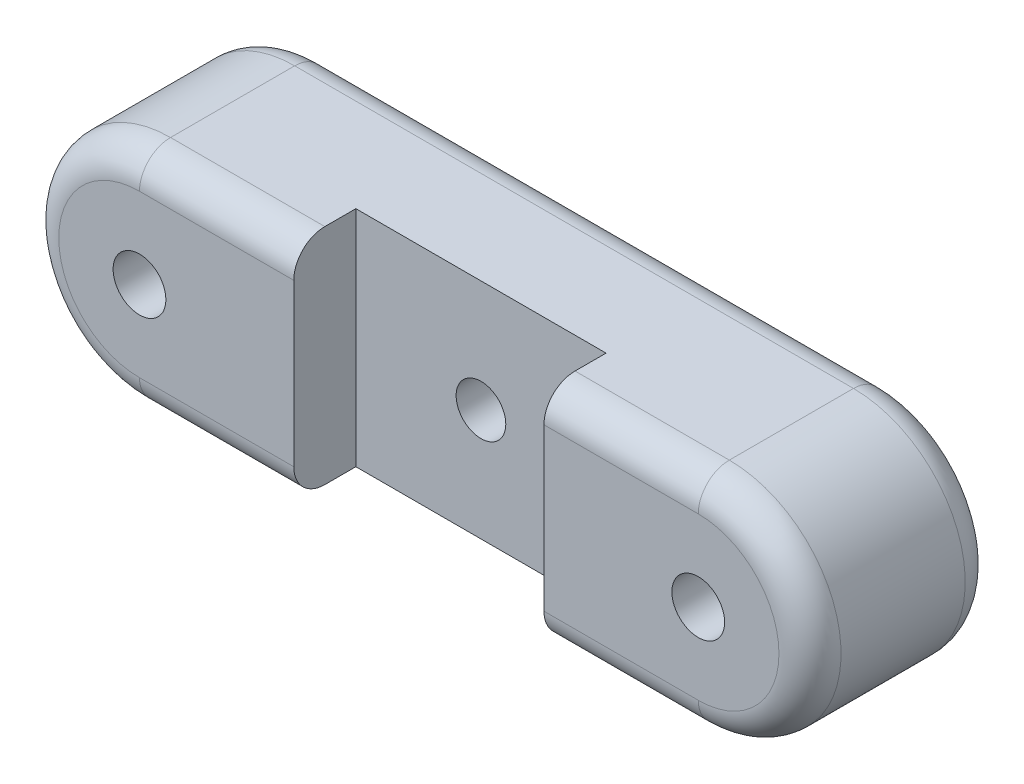
ISO-10303-21;
HEADER;
FILE_DESCRIPTION(('STEP AP214'),'2;1');
FILE_NAME('part.step','',(''),(''),'','','');
FILE_SCHEMA(('AUTOMOTIVE_DESIGN { 1 0 10303 214 1 1 1 1 }'));
ENDSEC;
DATA;
#1=APPLICATION_CONTEXT('core data for automotive mechanical design processes');
#2=APPLICATION_PROTOCOL_DEFINITION('international standard','automotive_design',2000,#1);
#3=PRODUCT_CONTEXT('',#1,'mechanical');
#4=PRODUCT('Part','Part','',(#3));
#5=PRODUCT_RELATED_PRODUCT_CATEGORY('part','',(#4));
#6=PRODUCT_DEFINITION_FORMATION('','',#4);
#7=PRODUCT_DEFINITION_CONTEXT('part definition',#1,'design');
#8=PRODUCT_DEFINITION('design','',#6,#7);
#9=PRODUCT_DEFINITION_SHAPE('','',#8);
#10=(LENGTH_UNIT() NAMED_UNIT(*) SI_UNIT(.MILLI.,.METRE.));
#11=(NAMED_UNIT(*) PLANE_ANGLE_UNIT() SI_UNIT($,.RADIAN.));
#12=(NAMED_UNIT(*) SI_UNIT($,.STERADIAN.) SOLID_ANGLE_UNIT());
#13=UNCERTAINTY_MEASURE_WITH_UNIT(LENGTH_MEASURE(1.E-05),#10,'distance_accuracy_value','');
#14=(GEOMETRIC_REPRESENTATION_CONTEXT(3) GLOBAL_UNCERTAINTY_ASSIGNED_CONTEXT((#13)) GLOBAL_UNIT_ASSIGNED_CONTEXT((#10,
#11,#12)) REPRESENTATION_CONTEXT('',''));
#15=CARTESIAN_POINT('',(0.,0.,0.));
#16=DIRECTION('',(0.,0.,1.));
#17=DIRECTION('',(1.,0.,0.));
#18=AXIS2_PLACEMENT_3D('',#15,#16,#17);
#19=CARTESIAN_POINT('',(-45.,0.,1220.));
#20=DIRECTION('',(0.,0.,1.));
#21=DIRECTION('',(1.,0.,0.));
#22=AXIS2_PLACEMENT_3D('',#19,#20,#21);
#23=PLANE('',#22);
#24=CARTESIAN_POINT('',(-45.,0.,1220.));
#25=DIRECTION('',(0.,0.,1.));
#26=DIRECTION('',(1.,0.,0.));
#27=AXIS2_PLACEMENT_3D('',#24,#25,#26);
#28=CIRCLE('',#27,13.);
#29=CARTESIAN_POINT('',(-45.,13.,1220.));
#30=VERTEX_POINT('',#29);
#31=CARTESIAN_POINT('',(-45.,-13.,1220.));
#32=VERTEX_POINT('',#31);
#33=EDGE_CURVE('E259',#30,#32,#28,.T.);
#34=ORIENTED_EDGE('',*,*,#33,.T.);
#35=DIRECTION('',(1.,0.,0.));
#36=VECTOR('',#35,1.);
#37=CARTESIAN_POINT('',(-45.,-13.,1220.));
#38=LINE('',#37,#36);
#39=CARTESIAN_POINT('',(-20.15,-13.,1220.));
#40=VERTEX_POINT('',#39);
#41=EDGE_CURVE('E261',#32,#40,#38,.T.);
#42=ORIENTED_EDGE('',*,*,#41,.T.);
#43=DIRECTION('',(0.,-1.,0.));
#44=VECTOR('',#43,1.);
#45=CARTESIAN_POINT('',(-20.15,18.,1220.));
#46=LINE('',#45,#44);
#47=CARTESIAN_POINT('',(-20.15,13.,1220.));
#48=VERTEX_POINT('',#47);
#49=EDGE_CURVE('E166',#48,#40,#46,.T.);
#50=ORIENTED_EDGE('',*,*,#49,.F.);
#51=DIRECTION('',(-1.,0.,0.));
#52=VECTOR('',#51,1.);
#53=CARTESIAN_POINT('',(-45.,13.,1220.));
#54=LINE('',#53,#52);
#55=EDGE_CURVE('E257',#48,#30,#54,.T.);
#56=ORIENTED_EDGE('',*,*,#55,.T.);
#57=EDGE_LOOP('',(#34,#42,#50,#56));
#58=FACE_BOUND('',#57,.T.);
#59=CARTESIAN_POINT('',(-45.,0.,1220.));
#60=DIRECTION('',(0.,0.,1.));
#61=DIRECTION('',(1.,0.,0.));
#62=AXIS2_PLACEMENT_3D('',#59,#60,#61);
#63=CIRCLE('',#62,4.25000000000001);
#64=CARTESIAN_POINT('',(-40.75,0.,1220.));
#65=VERTEX_POINT('',#64);
#66=EDGE_CURVE('E173',#65,#65,#63,.T.);
#67=ORIENTED_EDGE('',*,*,#66,.F.);
#68=EDGE_LOOP('',(#67));
#69=FACE_BOUND('',#68,.T.);
#70=ADVANCED_FACE('F39',(#58,#69),#23,.T.);
#71=CARTESIAN_POINT('',(-45.,0.,1190.));
#72=DIRECTION('',(0.,0.,1.));
#73=DIRECTION('',(1.,0.,0.));
#74=AXIS2_PLACEMENT_3D('',#71,#72,#73);
#75=CYLINDRICAL_SURFACE('',#74,8.1);
#76=CARTESIAN_POINT('',(-45.,0.,1190.));
#77=DIRECTION('',(0.,0.,1.));
#78=DIRECTION('',(1.,0.,0.));
#79=AXIS2_PLACEMENT_3D('',#76,#77,#78);
#80=CIRCLE('',#79,8.1);
#81=CARTESIAN_POINT('',(-36.9,0.,1190.));
#82=VERTEX_POINT('',#81);
#83=EDGE_CURVE('E192',#82,#82,#80,.T.);
#84=ORIENTED_EDGE('',*,*,#83,.F.);
#85=EDGE_LOOP('',(#84));
#86=FACE_BOUND('',#85,.T.);
#87=CARTESIAN_POINT('',(-45.,0.,1210.));
#88=DIRECTION('',(0.,0.,1.));
#89=DIRECTION('',(1.,0.,0.));
#90=AXIS2_PLACEMENT_3D('',#87,#88,#89);
#91=CIRCLE('',#90,8.1);
#92=CARTESIAN_POINT('',(-36.9,0.,1210.));
#93=VERTEX_POINT('',#92);
#94=EDGE_CURVE('E209',#93,#93,#91,.F.);
#95=ORIENTED_EDGE('',*,*,#94,.F.);
#96=EDGE_LOOP('',(#95));
#97=FACE_BOUND('',#96,.T.);
#98=ADVANCED_FACE('F309',(#86,#97),#75,.F.);
#99=CARTESIAN_POINT('',(45.,0.,1190.));
#100=DIRECTION('',(0.,0.,1.));
#101=DIRECTION('',(1.,0.,0.));
#102=AXIS2_PLACEMENT_3D('',#99,#100,#101);
#103=CYLINDRICAL_SURFACE('',#102,8.1);
#104=CARTESIAN_POINT('',(45.,0.,1190.));
#105=DIRECTION('',(0.,0.,1.));
#106=DIRECTION('',(1.,0.,0.));
#107=AXIS2_PLACEMENT_3D('',#104,#105,#106);
#108=CIRCLE('',#107,8.1);
#109=CARTESIAN_POINT('',(53.1,0.,1190.));
#110=VERTEX_POINT('',#109);
#111=EDGE_CURVE('E187',#110,#110,#108,.T.);
#112=ORIENTED_EDGE('',*,*,#111,.F.);
#113=EDGE_LOOP('',(#112));
#114=FACE_BOUND('',#113,.T.);
#115=CARTESIAN_POINT('',(45.,0.,1210.));
#116=DIRECTION('',(0.,0.,1.));
#117=DIRECTION('',(1.,0.,0.));
#118=AXIS2_PLACEMENT_3D('',#115,#116,#117);
#119=CIRCLE('',#118,8.1);
#120=CARTESIAN_POINT('',(53.1,0.,1210.));
#121=VERTEX_POINT('',#120);
#122=EDGE_CURVE('E199',#121,#121,#119,.F.);
#123=ORIENTED_EDGE('',*,*,#122,.F.);
#124=EDGE_LOOP('',(#123));
#125=FACE_BOUND('',#124,.T.);
#126=ADVANCED_FACE('F318',(#114,#125),#103,.F.);
#127=CARTESIAN_POINT('',(-45.,0.,1190.));
#128=DIRECTION('',(0.,0.,1.));
#129=DIRECTION('',(1.,0.,0.));
#130=AXIS2_PLACEMENT_3D('',#127,#128,#129);
#131=CYLINDRICAL_SURFACE('',#130,18.);
#132=DIRECTION('',(0.,0.,1.));
#133=VECTOR('',#132,1.);
#134=CARTESIAN_POINT('',(-45.,-18.,1190.));
#135=LINE('',#134,#133);
#136=CARTESIAN_POINT('',(-45.,-18.,1195.));
#137=VERTEX_POINT('',#136);
#138=CARTESIAN_POINT('',(-45.,-18.,1215.));
#139=VERTEX_POINT('',#138);
#140=EDGE_CURVE('E195',#137,#139,#135,.T.);
#141=ORIENTED_EDGE('',*,*,#140,.T.);
#142=CARTESIAN_POINT('',(-45.,0.,1215.));
#143=DIRECTION('',(0.,0.,1.));
#144=DIRECTION('',(1.,0.,0.));
#145=AXIS2_PLACEMENT_3D('',#142,#143,#144);
#146=CIRCLE('',#145,18.);
#147=CARTESIAN_POINT('',(-45.,18.,1215.));
#148=VERTEX_POINT('',#147);
#149=EDGE_CURVE('E11',#139,#148,#146,.F.);
#150=ORIENTED_EDGE('',*,*,#149,.T.);
#151=DIRECTION('',(0.,0.,1.));
#152=VECTOR('',#151,1.);
#153=CARTESIAN_POINT('',(-45.,18.,1190.));
#154=LINE('',#153,#152);
#155=CARTESIAN_POINT('',(-45.,18.,1195.));
#156=VERTEX_POINT('',#155);
#157=EDGE_CURVE('E196',#156,#148,#154,.T.);
#158=ORIENTED_EDGE('',*,*,#157,.F.);
#159=CARTESIAN_POINT('',(-45.,0.,1195.));
#160=DIRECTION('',(0.,0.,1.));
#161=DIRECTION('',(1.,0.,0.));
#162=AXIS2_PLACEMENT_3D('',#159,#160,#161);
#163=CIRCLE('',#162,18.);
#164=EDGE_CURVE('E226',#156,#137,#163,.T.);
#165=ORIENTED_EDGE('',*,*,#164,.T.);
#166=EDGE_LOOP('',(#141,#150,#158,#165));
#167=FACE_BOUND('',#166,.T.);
#168=ADVANCED_FACE('F355',(#167),#131,.T.);
#169=CARTESIAN_POINT('',(-45.,18.,1190.));
#170=DIRECTION('',(0.,1.,0.));
#171=DIRECTION('',(0.,0.,1.));
#172=AXIS2_PLACEMENT_3D('',#169,#170,#171);
#173=PLANE('',#172);
#174=DIRECTION('',(0.,0.,1.));
#175=VECTOR('',#174,1.);
#176=CARTESIAN_POINT('',(20.15,18.,1210.));
#177=LINE('',#176,#175);
#178=CARTESIAN_POINT('',(20.15,18.,1210.));
#179=VERTEX_POINT('',#178);
#180=CARTESIAN_POINT('',(20.15,18.,1215.));
#181=VERTEX_POINT('',#180);
#182=EDGE_CURVE('E174',#179,#181,#177,.T.);
#183=ORIENTED_EDGE('',*,*,#182,.T.);
#184=DIRECTION('',(-1.,0.,0.));
#185=VECTOR('',#184,1.);
#186=CARTESIAN_POINT('',(-45.,18.,1215.));
#187=LINE('',#186,#185);
#188=CARTESIAN_POINT('',(45.,18.,1215.));
#189=VERTEX_POINT('',#188);
#190=EDGE_CURVE('E253',#181,#189,#187,.F.);
#191=ORIENTED_EDGE('',*,*,#190,.T.);
#192=DIRECTION('',(0.,0.,1.));
#193=VECTOR('',#192,1.);
#194=CARTESIAN_POINT('',(45.,18.,1190.));
#195=LINE('',#194,#193);
#196=CARTESIAN_POINT('',(45.,18.,1195.));
#197=VERTEX_POINT('',#196);
#198=EDGE_CURVE('E200',#197,#189,#195,.T.);
#199=ORIENTED_EDGE('',*,*,#198,.F.);
#200=DIRECTION('',(-1.,0.,0.));
#201=VECTOR('',#200,1.);
#202=CARTESIAN_POINT('',(-45.,18.,1195.));
#203=LINE('',#202,#201);
#204=EDGE_CURVE('E228',#197,#156,#203,.T.);
#205=ORIENTED_EDGE('',*,*,#204,.T.);
#206=ORIENTED_EDGE('',*,*,#157,.T.);
#207=DIRECTION('',(-1.,0.,0.));
#208=VECTOR('',#207,1.);
#209=CARTESIAN_POINT('',(-45.,18.,1215.));
#210=LINE('',#209,#208);
#211=CARTESIAN_POINT('',(-20.15,18.,1215.));
#212=VERTEX_POINT('',#211);
#213=EDGE_CURVE('E251',#148,#212,#210,.F.);
#214=ORIENTED_EDGE('',*,*,#213,.T.);
#215=DIRECTION('',(0.,0.,1.));
#216=VECTOR('',#215,1.);
#217=CARTESIAN_POINT('',(-20.15,18.,1210.));
#218=LINE('',#217,#216);
#219=CARTESIAN_POINT('',(-20.15,18.,1210.));
#220=VERTEX_POINT('',#219);
#221=EDGE_CURVE('E171',#220,#212,#218,.T.);
#222=ORIENTED_EDGE('',*,*,#221,.F.);
#223=DIRECTION('',(-1.,0.,0.));
#224=VECTOR('',#223,1.);
#225=CARTESIAN_POINT('',(-20.15,18.,1210.));
#226=LINE('',#225,#224);
#227=EDGE_CURVE('E146',#179,#220,#226,.T.);
#228=ORIENTED_EDGE('',*,*,#227,.F.);
#229=EDGE_LOOP('',(#183,#191,#199,#205,#206,#214,#222,#228));
#230=FACE_BOUND('',#229,.T.);
#231=ADVANCED_FACE('F359',(#230),#173,.T.);
#232=CARTESIAN_POINT('',(45.,0.,1190.));
#233=DIRECTION('',(0.,0.,1.));
#234=DIRECTION('',(1.,0.,0.));
#235=AXIS2_PLACEMENT_3D('',#232,#233,#234);
#236=CYLINDRICAL_SURFACE('',#235,18.);
#237=ORIENTED_EDGE('',*,*,#198,.T.);
#238=CARTESIAN_POINT('',(45.,0.,1215.));
#239=DIRECTION('',(0.,0.,1.));
#240=DIRECTION('',(1.,0.,0.));
#241=AXIS2_PLACEMENT_3D('',#238,#239,#240);
#242=CIRCLE('',#241,18.);
#243=CARTESIAN_POINT('',(45.,-18.,1215.));
#244=VERTEX_POINT('',#243);
#245=EDGE_CURVE('E255',#189,#244,#242,.F.);
#246=ORIENTED_EDGE('',*,*,#245,.T.);
#247=DIRECTION('',(0.,0.,1.));
#248=VECTOR('',#247,1.);
#249=CARTESIAN_POINT('',(45.,-18.,1190.));
#250=LINE('',#249,#248);
#251=CARTESIAN_POINT('',(45.,-18.,1195.));
#252=VERTEX_POINT('',#251);
#253=EDGE_CURVE('E203',#252,#244,#250,.T.);
#254=ORIENTED_EDGE('',*,*,#253,.F.);
#255=CARTESIAN_POINT('',(45.,0.,1195.));
#256=DIRECTION('',(0.,0.,1.));
#257=DIRECTION('',(1.,0.,0.));
#258=AXIS2_PLACEMENT_3D('',#255,#256,#257);
#259=CIRCLE('',#258,18.);
#260=EDGE_CURVE('E212',#252,#197,#259,.T.);
#261=ORIENTED_EDGE('',*,*,#260,.T.);
#262=EDGE_LOOP('',(#237,#246,#254,#261));
#263=FACE_BOUND('',#262,.T.);
#264=ADVANCED_FACE('F375',(#263),#236,.T.);
#265=CARTESIAN_POINT('',(-45.,-18.,1190.));
#266=DIRECTION('',(0.,-1.,0.));
#267=DIRECTION('',(0.,0.,-1.));
#268=AXIS2_PLACEMENT_3D('',#265,#266,#267);
#269=PLANE('',#268);
#270=DIRECTION('',(0.,0.,1.));
#271=VECTOR('',#270,1.);
#272=CARTESIAN_POINT('',(-20.15,-18.,1210.));
#273=LINE('',#272,#271);
#274=CARTESIAN_POINT('',(-20.15,-18.,1210.));
#275=VERTEX_POINT('',#274);
#276=CARTESIAN_POINT('',(-20.15,-18.,1215.));
#277=VERTEX_POINT('',#276);
#278=EDGE_CURVE('E138',#275,#277,#273,.T.);
#279=ORIENTED_EDGE('',*,*,#278,.T.);
#280=DIRECTION('',(1.,0.,0.));
#281=VECTOR('',#280,1.);
#282=CARTESIAN_POINT('',(-45.,-18.,1215.));
#283=LINE('',#282,#281);
#284=EDGE_CURVE('E48',#277,#139,#283,.F.);
#285=ORIENTED_EDGE('',*,*,#284,.T.);
#286=ORIENTED_EDGE('',*,*,#140,.F.);
#287=DIRECTION('',(1.,0.,0.));
#288=VECTOR('',#287,1.);
#289=CARTESIAN_POINT('',(45.,-18.,1195.));
#290=LINE('',#289,#288);
#291=EDGE_CURVE('E224',#137,#252,#290,.T.);
#292=ORIENTED_EDGE('',*,*,#291,.T.);
#293=ORIENTED_EDGE('',*,*,#253,.T.);
#294=DIRECTION('',(1.,0.,0.));
#295=VECTOR('',#294,1.);
#296=CARTESIAN_POINT('',(-45.,-18.,1215.));
#297=LINE('',#296,#295);
#298=CARTESIAN_POINT('',(20.15,-18.,1215.));
#299=VERTEX_POINT('',#298);
#300=EDGE_CURVE('E267',#244,#299,#297,.F.);
#301=ORIENTED_EDGE('',*,*,#300,.T.);
#302=DIRECTION('',(0.,0.,1.));
#303=VECTOR('',#302,1.);
#304=CARTESIAN_POINT('',(20.15,-18.,1210.));
#305=LINE('',#304,#303);
#306=CARTESIAN_POINT('',(20.15,-18.,1210.));
#307=VERTEX_POINT('',#306);
#308=EDGE_CURVE('E145',#307,#299,#305,.T.);
#309=ORIENTED_EDGE('',*,*,#308,.F.);
#310=DIRECTION('',(1.,0.,0.));
#311=VECTOR('',#310,1.);
#312=CARTESIAN_POINT('',(-20.15,-18.,1210.));
#313=LINE('',#312,#311);
#314=EDGE_CURVE('E152',#275,#307,#313,.T.);
#315=ORIENTED_EDGE('',*,*,#314,.F.);
#316=EDGE_LOOP('',(#279,#285,#286,#292,#293,#301,#309,#315));
#317=FACE_BOUND('',#316,.T.);
#318=ADVANCED_FACE('F158',(#317),#269,.T.);
#319=CARTESIAN_POINT('',(-45.,0.,1190.));
#320=DIRECTION('',(0.,0.,1.));
#321=DIRECTION('',(1.,0.,0.));
#322=AXIS2_PLACEMENT_3D('',#319,#320,#321);
#323=PLANE('',#322);
#324=CARTESIAN_POINT('',(0.,0.,1190.));
#325=DIRECTION('',(0.,0.,1.));
#326=DIRECTION('',(1.,0.,0.));
#327=AXIS2_PLACEMENT_3D('',#324,#325,#326);
#328=CIRCLE('',#327,4.);
#329=CARTESIAN_POINT('',(4.,0.,1190.));
#330=VERTEX_POINT('',#329);
#331=EDGE_CURVE('E276',#330,#330,#328,.T.);
#332=ORIENTED_EDGE('',*,*,#331,.T.);
#333=EDGE_LOOP('',(#332));
#334=FACE_BOUND('',#333,.T.);
#335=DIRECTION('',(-1.,0.,0.));
#336=VECTOR('',#335,1.);
#337=CARTESIAN_POINT('',(45.,13.,1190.));
#338=LINE('',#337,#336);
#339=CARTESIAN_POINT('',(-45.,13.,1190.));
#340=VERTEX_POINT('',#339);
#341=CARTESIAN_POINT('',(45.,13.,1190.));
#342=VERTEX_POINT('',#341);
#343=EDGE_CURVE('E215',#340,#342,#338,.F.);
#344=ORIENTED_EDGE('',*,*,#343,.T.);
#345=CARTESIAN_POINT('',(45.,0.,1190.));
#346=DIRECTION('',(0.,0.,1.));
#347=DIRECTION('',(1.,0.,0.));
#348=AXIS2_PLACEMENT_3D('',#345,#346,#347);
#349=CIRCLE('',#348,13.);
#350=CARTESIAN_POINT('',(45.,-13.,1190.));
#351=VERTEX_POINT('',#350);
#352=EDGE_CURVE('E221',#342,#351,#349,.F.);
#353=ORIENTED_EDGE('',*,*,#352,.T.);
#354=DIRECTION('',(1.,0.,0.));
#355=VECTOR('',#354,1.);
#356=CARTESIAN_POINT('',(-45.,-13.,1190.));
#357=LINE('',#356,#355);
#358=CARTESIAN_POINT('',(-45.,-13.,1190.));
#359=VERTEX_POINT('',#358);
#360=EDGE_CURVE('E219',#351,#359,#357,.F.);
#361=ORIENTED_EDGE('',*,*,#360,.T.);
#362=CARTESIAN_POINT('',(-45.,0.,1190.));
#363=DIRECTION('',(0.,0.,1.));
#364=DIRECTION('',(1.,0.,0.));
#365=AXIS2_PLACEMENT_3D('',#362,#363,#364);
#366=CIRCLE('',#365,13.);
#367=EDGE_CURVE('E217',#359,#340,#366,.F.);
#368=ORIENTED_EDGE('',*,*,#367,.T.);
#369=EDGE_LOOP('',(#344,#353,#361,#368));
#370=FACE_BOUND('',#369,.T.);
#371=ORIENTED_EDGE('',*,*,#111,.T.);
#372=EDGE_LOOP('',(#371));
#373=FACE_BOUND('',#372,.T.);
#374=ORIENTED_EDGE('',*,*,#83,.T.);
#375=EDGE_LOOP('',(#374));
#376=FACE_BOUND('',#375,.T.);
#377=ADVANCED_FACE('F326',(#334,#370,#373,#376),#323,.F.);
#378=CARTESIAN_POINT('',(45.,0.,1220.));
#379=DIRECTION('',(0.,0.,1.));
#380=DIRECTION('',(1.,0.,0.));
#381=AXIS2_PLACEMENT_3D('',#378,#379,#380);
#382=CIRCLE('',#381,13.);
#383=CARTESIAN_POINT('',(45.,-13.,1220.));
#384=VERTEX_POINT('',#383);
#385=CARTESIAN_POINT('',(45.,13.,1220.));
#386=VERTEX_POINT('',#385);
#387=EDGE_CURVE('E242',#384,#386,#382,.T.);
#388=ORIENTED_EDGE('',*,*,#387,.T.);
#389=DIRECTION('',(-1.,0.,0.));
#390=VECTOR('',#389,1.);
#391=CARTESIAN_POINT('',(-45.,13.,1220.));
#392=LINE('',#391,#390);
#393=CARTESIAN_POINT('',(20.15,13.,1220.));
#394=VERTEX_POINT('',#393);
#395=EDGE_CURVE('E244',#386,#394,#392,.T.);
#396=ORIENTED_EDGE('',*,*,#395,.T.);
#397=DIRECTION('',(0.,1.,0.));
#398=VECTOR('',#397,1.);
#399=CARTESIAN_POINT('',(20.15,18.,1220.));
#400=LINE('',#399,#398);
#401=CARTESIAN_POINT('',(20.15,-13.,1220.));
#402=VERTEX_POINT('',#401);
#403=EDGE_CURVE('E156',#402,#394,#400,.T.);
#404=ORIENTED_EDGE('',*,*,#403,.F.);
#405=DIRECTION('',(1.,0.,0.));
#406=VECTOR('',#405,1.);
#407=CARTESIAN_POINT('',(-45.,-13.,1220.));
#408=LINE('',#407,#406);
#409=EDGE_CURVE('E230',#402,#384,#408,.T.);
#410=ORIENTED_EDGE('',*,*,#409,.T.);
#411=EDGE_LOOP('',(#388,#396,#404,#410));
#412=FACE_BOUND('',#411,.T.);
#413=CARTESIAN_POINT('',(45.,0.,1220.));
#414=DIRECTION('',(0.,0.,1.));
#415=DIRECTION('',(1.,0.,0.));
#416=AXIS2_PLACEMENT_3D('',#413,#414,#415);
#417=CIRCLE('',#416,4.25000000000001);
#418=CARTESIAN_POINT('',(49.25,0.,1220.));
#419=VERTEX_POINT('',#418);
#420=EDGE_CURVE('E181',#419,#419,#417,.T.);
#421=ORIENTED_EDGE('',*,*,#420,.F.);
#422=EDGE_LOOP('',(#421));
#423=FACE_BOUND('',#422,.T.);
#424=ADVANCED_FACE('F312',(#412,#423),#23,.T.);
#425=CARTESIAN_POINT('',(45.,0.,1210.));
#426=DIRECTION('',(0.,0.,1.));
#427=DIRECTION('',(1.,0.,0.));
#428=AXIS2_PLACEMENT_3D('',#425,#426,#427);
#429=PLANE('',#428);
#430=CARTESIAN_POINT('',(45.,0.,1210.));
#431=DIRECTION('',(0.,0.,1.));
#432=DIRECTION('',(1.,0.,0.));
#433=AXIS2_PLACEMENT_3D('',#430,#431,#432);
#434=CIRCLE('',#433,4.25000000000001);
#435=CARTESIAN_POINT('',(49.25,0.,1210.));
#436=VERTEX_POINT('',#435);
#437=EDGE_CURVE('E184',#436,#436,#434,.T.);
#438=ORIENTED_EDGE('',*,*,#437,.T.);
#439=EDGE_LOOP('',(#438));
#440=FACE_BOUND('',#439,.T.);
#441=ORIENTED_EDGE('',*,*,#122,.T.);
#442=EDGE_LOOP('',(#441));
#443=FACE_BOUND('',#442,.T.);
#444=ADVANCED_FACE('F325',(#440,#443),#429,.F.);
#445=CARTESIAN_POINT('',(45.,0.,1210.));
#446=DIRECTION('',(0.,0.,1.));
#447=DIRECTION('',(1.,0.,0.));
#448=AXIS2_PLACEMENT_3D('',#445,#446,#447);
#449=CYLINDRICAL_SURFACE('',#448,4.25000000000001);
#450=ORIENTED_EDGE('',*,*,#437,.F.);
#451=EDGE_LOOP('',(#450));
#452=FACE_BOUND('',#451,.T.);
#453=ORIENTED_EDGE('',*,*,#420,.T.);
#454=EDGE_LOOP('',(#453));
#455=FACE_BOUND('',#454,.T.);
#456=ADVANCED_FACE('F333',(#452,#455),#449,.F.);
#457=CARTESIAN_POINT('',(-45.,0.,1210.));
#458=DIRECTION('',(0.,0.,1.));
#459=DIRECTION('',(1.,0.,0.));
#460=AXIS2_PLACEMENT_3D('',#457,#458,#459);
#461=PLANE('',#460);
#462=CARTESIAN_POINT('',(-45.,0.,1210.));
#463=DIRECTION('',(0.,0.,1.));
#464=DIRECTION('',(1.,0.,0.));
#465=AXIS2_PLACEMENT_3D('',#462,#463,#464);
#466=CIRCLE('',#465,4.25000000000001);
#467=CARTESIAN_POINT('',(-40.75,0.,1210.));
#468=VERTEX_POINT('',#467);
#469=EDGE_CURVE('E178',#468,#468,#466,.T.);
#470=ORIENTED_EDGE('',*,*,#469,.T.);
#471=EDGE_LOOP('',(#470));
#472=FACE_BOUND('',#471,.T.);
#473=ORIENTED_EDGE('',*,*,#94,.T.);
#474=EDGE_LOOP('',(#473));
#475=FACE_BOUND('',#474,.T.);
#476=ADVANCED_FACE('F342',(#472,#475),#461,.F.);
#477=CARTESIAN_POINT('',(-45.,0.,1210.));
#478=DIRECTION('',(0.,0.,1.));
#479=DIRECTION('',(1.,0.,0.));
#480=AXIS2_PLACEMENT_3D('',#477,#478,#479);
#481=CYLINDRICAL_SURFACE('',#480,4.25000000000001);
#482=ORIENTED_EDGE('',*,*,#469,.F.);
#483=EDGE_LOOP('',(#482));
#484=FACE_BOUND('',#483,.T.);
#485=ORIENTED_EDGE('',*,*,#66,.T.);
#486=EDGE_LOOP('',(#485));
#487=FACE_BOUND('',#486,.T.);
#488=ADVANCED_FACE('F348',(#484,#487),#481,.F.);
#489=CARTESIAN_POINT('',(-20.15,18.,1210.));
#490=DIRECTION('',(-1.,0.,0.));
#491=DIRECTION('',(0.,-1.,0.));
#492=AXIS2_PLACEMENT_3D('',#489,#490,#491);
#493=PLANE('',#492);
#494=ORIENTED_EDGE('',*,*,#49,.T.);
#495=CARTESIAN_POINT('',(-20.15,-13.,1215.));
#496=DIRECTION('',(-1.,0.,0.));
#497=DIRECTION('',(0.,-1.,0.));
#498=AXIS2_PLACEMENT_3D('',#495,#496,#497);
#499=CIRCLE('',#498,5.);
#500=EDGE_CURVE('E63',#40,#277,#499,.F.);
#501=ORIENTED_EDGE('',*,*,#500,.T.);
#502=ORIENTED_EDGE('',*,*,#278,.F.);
#503=DIRECTION('',(0.,-1.,0.));
#504=VECTOR('',#503,1.);
#505=CARTESIAN_POINT('',(-20.15,18.,1210.));
#506=LINE('',#505,#504);
#507=EDGE_CURVE('E142',#220,#275,#506,.T.);
#508=ORIENTED_EDGE('',*,*,#507,.F.);
#509=ORIENTED_EDGE('',*,*,#221,.T.);
#510=CARTESIAN_POINT('',(-20.15,13.,1215.));
#511=DIRECTION('',(-1.,0.,0.));
#512=DIRECTION('',(0.,-1.,0.));
#513=AXIS2_PLACEMENT_3D('',#510,#511,#512);
#514=CIRCLE('',#513,5.);
#515=EDGE_CURVE('E264',#212,#48,#514,.F.);
#516=ORIENTED_EDGE('',*,*,#515,.T.);
#517=EDGE_LOOP('',(#494,#501,#502,#508,#509,#516));
#518=FACE_BOUND('',#517,.T.);
#519=ADVANCED_FACE('F140',(#518),#493,.F.);
#520=CARTESIAN_POINT('',(20.15,18.,1210.));
#521=DIRECTION('',(1.,0.,0.));
#522=DIRECTION('',(0.,1.,0.));
#523=AXIS2_PLACEMENT_3D('',#520,#521,#522);
#524=PLANE('',#523);
#525=ORIENTED_EDGE('',*,*,#403,.T.);
#526=CARTESIAN_POINT('',(20.15,13.,1215.));
#527=DIRECTION('',(1.,0.,0.));
#528=DIRECTION('',(0.,1.,0.));
#529=AXIS2_PLACEMENT_3D('',#526,#527,#528);
#530=CIRCLE('',#529,5.);
#531=EDGE_CURVE('E249',#394,#181,#530,.F.);
#532=ORIENTED_EDGE('',*,*,#531,.T.);
#533=ORIENTED_EDGE('',*,*,#182,.F.);
#534=DIRECTION('',(0.,1.,0.));
#535=VECTOR('',#534,1.);
#536=CARTESIAN_POINT('',(20.15,18.,1210.));
#537=LINE('',#536,#535);
#538=EDGE_CURVE('E160',#307,#179,#537,.T.);
#539=ORIENTED_EDGE('',*,*,#538,.F.);
#540=ORIENTED_EDGE('',*,*,#308,.T.);
#541=CARTESIAN_POINT('',(20.15,-13.,1215.));
#542=DIRECTION('',(1.,0.,0.));
#543=DIRECTION('',(0.,1.,0.));
#544=AXIS2_PLACEMENT_3D('',#541,#542,#543);
#545=CIRCLE('',#544,5.);
#546=EDGE_CURVE('E247',#299,#402,#545,.F.);
#547=ORIENTED_EDGE('',*,*,#546,.T.);
#548=EDGE_LOOP('',(#525,#532,#533,#539,#540,#547));
#549=FACE_BOUND('',#548,.T.);
#550=ADVANCED_FACE('F294',(#549),#524,.F.);
#551=CARTESIAN_POINT('',(0.,0.,1210.));
#552=DIRECTION('',(0.,0.,1.));
#553=DIRECTION('',(1.,0.,0.));
#554=AXIS2_PLACEMENT_3D('',#551,#552,#553);
#555=PLANE('',#554);
#556=CARTESIAN_POINT('',(0.,0.,1210.));
#557=DIRECTION('',(0.,0.,1.));
#558=DIRECTION('',(1.,0.,0.));
#559=AXIS2_PLACEMENT_3D('',#556,#557,#558);
#560=CIRCLE('',#559,4.);
#561=CARTESIAN_POINT('',(4.,0.,1210.));
#562=VERTEX_POINT('',#561);
#563=EDGE_CURVE('E282',#562,#562,#560,.T.);
#564=ORIENTED_EDGE('',*,*,#563,.F.);
#565=EDGE_LOOP('',(#564));
#566=FACE_BOUND('',#565,.T.);
#567=ORIENTED_EDGE('',*,*,#507,.T.);
#568=ORIENTED_EDGE('',*,*,#314,.T.);
#569=ORIENTED_EDGE('',*,*,#538,.T.);
#570=ORIENTED_EDGE('',*,*,#227,.T.);
#571=EDGE_LOOP('',(#567,#568,#569,#570));
#572=FACE_BOUND('',#571,.T.);
#573=ADVANCED_FACE('F150',(#566,#572),#555,.T.);
#574=CARTESIAN_POINT('',(-45.,0.,1195.));
#575=DIRECTION('',(0.,0.,1.));
#576=DIRECTION('',(1.,0.,0.));
#577=AXIS2_PLACEMENT_3D('',#574,#575,#576);
#578=TOROIDAL_SURFACE('',#577,13.,5.);
#579=CARTESIAN_POINT('',(-45.,13.,1195.));
#580=DIRECTION('',(1.,0.,0.));
#581=DIRECTION('',(0.,1.,0.));
#582=AXIS2_PLACEMENT_3D('',#579,#580,#581);
#583=CIRCLE('',#582,5.);
#584=EDGE_CURVE('E236',#340,#156,#583,.T.);
#585=ORIENTED_EDGE('',*,*,#584,.F.);
#586=ORIENTED_EDGE('',*,*,#367,.F.);
#587=CARTESIAN_POINT('',(-45.,-13.,1195.));
#588=DIRECTION('',(1.,0.,0.));
#589=DIRECTION('',(0.,0.,-1.));
#590=AXIS2_PLACEMENT_3D('',#587,#588,#589);
#591=CIRCLE('',#590,5.);
#592=EDGE_CURVE('E168',#137,#359,#591,.T.);
#593=ORIENTED_EDGE('',*,*,#592,.F.);
#594=ORIENTED_EDGE('',*,*,#164,.F.);
#595=EDGE_LOOP('',(#585,#586,#593,#594));
#596=FACE_BOUND('',#595,.T.);
#597=ADVANCED_FACE('F293',(#596),#578,.T.);
#598=CARTESIAN_POINT('',(-45.,-13.,1195.));
#599=DIRECTION('',(-1.,0.,0.));
#600=DIRECTION('',(0.,0.,1.));
#601=AXIS2_PLACEMENT_3D('',#598,#599,#600);
#602=CYLINDRICAL_SURFACE('',#601,5.);
#603=ORIENTED_EDGE('',*,*,#592,.T.);
#604=ORIENTED_EDGE('',*,*,#360,.F.);
#605=CARTESIAN_POINT('',(45.,-13.,1195.));
#606=DIRECTION('',(1.,0.,0.));
#607=DIRECTION('',(0.,0.,-1.));
#608=AXIS2_PLACEMENT_3D('',#605,#606,#607);
#609=CIRCLE('',#608,5.);
#610=EDGE_CURVE('E233',#252,#351,#609,.T.);
#611=ORIENTED_EDGE('',*,*,#610,.F.);
#612=ORIENTED_EDGE('',*,*,#291,.F.);
#613=EDGE_LOOP('',(#603,#604,#611,#612));
#614=FACE_BOUND('',#613,.T.);
#615=ADVANCED_FACE('F301',(#614),#602,.T.);
#616=CARTESIAN_POINT('',(-45.,13.,1195.));
#617=DIRECTION('',(1.,0.,0.));
#618=DIRECTION('',(0.,0.,-1.));
#619=AXIS2_PLACEMENT_3D('',#616,#617,#618);
#620=CYLINDRICAL_SURFACE('',#619,5.);
#621=ORIENTED_EDGE('',*,*,#584,.T.);
#622=ORIENTED_EDGE('',*,*,#204,.F.);
#623=CARTESIAN_POINT('',(45.,13.,1195.));
#624=DIRECTION('',(1.,0.,0.));
#625=DIRECTION('',(0.,1.,0.));
#626=AXIS2_PLACEMENT_3D('',#623,#624,#625);
#627=CIRCLE('',#626,5.);
#628=EDGE_CURVE('E231',#342,#197,#627,.T.);
#629=ORIENTED_EDGE('',*,*,#628,.F.);
#630=ORIENTED_EDGE('',*,*,#343,.F.);
#631=EDGE_LOOP('',(#621,#622,#629,#630));
#632=FACE_BOUND('',#631,.T.);
#633=ADVANCED_FACE('F383',(#632),#620,.T.);
#634=CARTESIAN_POINT('',(45.,0.,1195.));
#635=DIRECTION('',(0.,0.,1.));
#636=DIRECTION('',(1.,0.,0.));
#637=AXIS2_PLACEMENT_3D('',#634,#635,#636);
#638=TOROIDAL_SURFACE('',#637,13.,5.);
#639=ORIENTED_EDGE('',*,*,#610,.T.);
#640=ORIENTED_EDGE('',*,*,#352,.F.);
#641=ORIENTED_EDGE('',*,*,#628,.T.);
#642=ORIENTED_EDGE('',*,*,#260,.F.);
#643=EDGE_LOOP('',(#639,#640,#641,#642));
#644=FACE_BOUND('',#643,.T.);
#645=ADVANCED_FACE('F380',(#644),#638,.T.);
#646=CARTESIAN_POINT('',(-45.,-13.,1215.));
#647=DIRECTION('',(1.,0.,0.));
#648=DIRECTION('',(0.,0.,-1.));
#649=AXIS2_PLACEMENT_3D('',#646,#647,#648);
#650=CYLINDRICAL_SURFACE('',#649,5.);
#651=ORIENTED_EDGE('',*,*,#546,.F.);
#652=ORIENTED_EDGE('',*,*,#300,.F.);
#653=CARTESIAN_POINT('',(45.,-13.,1215.));
#654=DIRECTION('',(1.,0.,0.));
#655=DIRECTION('',(0.,1.,0.));
#656=AXIS2_PLACEMENT_3D('',#653,#654,#655);
#657=CIRCLE('',#656,5.);
#658=EDGE_CURVE('E234',#384,#244,#657,.T.);
#659=ORIENTED_EDGE('',*,*,#658,.F.);
#660=ORIENTED_EDGE('',*,*,#409,.F.);
#661=EDGE_LOOP('',(#651,#652,#659,#660));
#662=FACE_BOUND('',#661,.T.);
#663=ADVANCED_FACE('F382',(#662),#650,.T.);
#664=CARTESIAN_POINT('',(45.,0.,1215.));
#665=DIRECTION('',(0.,0.,1.));
#666=DIRECTION('',(1.,0.,0.));
#667=AXIS2_PLACEMENT_3D('',#664,#665,#666);
#668=TOROIDAL_SURFACE('',#667,13.,5.);
#669=ORIENTED_EDGE('',*,*,#658,.T.);
#670=ORIENTED_EDGE('',*,*,#245,.F.);
#671=CARTESIAN_POINT('',(45.,13.,1215.));
#672=DIRECTION('',(-1.,0.,0.));
#673=DIRECTION('',(0.,0.,1.));
#674=AXIS2_PLACEMENT_3D('',#671,#672,#673);
#675=CIRCLE('',#674,5.);
#676=EDGE_CURVE('E270',#386,#189,#675,.T.);
#677=ORIENTED_EDGE('',*,*,#676,.F.);
#678=ORIENTED_EDGE('',*,*,#387,.F.);
#679=EDGE_LOOP('',(#669,#670,#677,#678));
#680=FACE_BOUND('',#679,.T.);
#681=ADVANCED_FACE('F394',(#680),#668,.T.);
#682=CARTESIAN_POINT('',(-45.,13.,1215.));
#683=DIRECTION('',(-1.,0.,0.));
#684=DIRECTION('',(0.,0.,1.));
#685=AXIS2_PLACEMENT_3D('',#682,#683,#684);
#686=CYLINDRICAL_SURFACE('',#685,5.);
#687=ORIENTED_EDGE('',*,*,#676,.T.);
#688=ORIENTED_EDGE('',*,*,#190,.F.);
#689=ORIENTED_EDGE('',*,*,#531,.F.);
#690=ORIENTED_EDGE('',*,*,#395,.F.);
#691=EDGE_LOOP('',(#687,#688,#689,#690));
#692=FACE_BOUND('',#691,.T.);
#693=ADVANCED_FACE('F391',(#692),#686,.T.);
#694=CARTESIAN_POINT('',(-45.,13.,1215.));
#695=DIRECTION('',(-1.,0.,0.));
#696=DIRECTION('',(0.,0.,1.));
#697=AXIS2_PLACEMENT_3D('',#694,#695,#696);
#698=CYLINDRICAL_SURFACE('',#697,5.);
#699=ORIENTED_EDGE('',*,*,#515,.F.);
#700=ORIENTED_EDGE('',*,*,#213,.F.);
#701=CARTESIAN_POINT('',(-45.,13.,1215.));
#702=DIRECTION('',(-1.,0.,0.));
#703=DIRECTION('',(0.,-1.,0.));
#704=AXIS2_PLACEMENT_3D('',#701,#702,#703);
#705=CIRCLE('',#704,5.);
#706=EDGE_CURVE('E43',#30,#148,#705,.T.);
#707=ORIENTED_EDGE('',*,*,#706,.F.);
#708=ORIENTED_EDGE('',*,*,#55,.F.);
#709=EDGE_LOOP('',(#699,#700,#707,#708));
#710=FACE_BOUND('',#709,.T.);
#711=ADVANCED_FACE('F41',(#710),#698,.T.);
#712=CARTESIAN_POINT('',(-45.,0.,1215.));
#713=DIRECTION('',(0.,0.,1.));
#714=DIRECTION('',(1.,0.,0.));
#715=AXIS2_PLACEMENT_3D('',#712,#713,#714);
#716=TOROIDAL_SURFACE('',#715,13.,5.);
#717=ORIENTED_EDGE('',*,*,#706,.T.);
#718=ORIENTED_EDGE('',*,*,#149,.F.);
#719=CARTESIAN_POINT('',(-45.,-13.,1215.));
#720=DIRECTION('',(1.,0.,0.));
#721=DIRECTION('',(0.,0.,-1.));
#722=AXIS2_PLACEMENT_3D('',#719,#720,#721);
#723=CIRCLE('',#722,5.);
#724=EDGE_CURVE('E274',#32,#139,#723,.T.);
#725=ORIENTED_EDGE('',*,*,#724,.F.);
#726=ORIENTED_EDGE('',*,*,#33,.F.);
#727=EDGE_LOOP('',(#717,#718,#725,#726));
#728=FACE_BOUND('',#727,.T.);
#729=ADVANCED_FACE('F404',(#728),#716,.T.);
#730=CARTESIAN_POINT('',(-45.,-13.,1215.));
#731=DIRECTION('',(1.,0.,0.));
#732=DIRECTION('',(0.,0.,-1.));
#733=AXIS2_PLACEMENT_3D('',#730,#731,#732);
#734=CYLINDRICAL_SURFACE('',#733,5.);
#735=ORIENTED_EDGE('',*,*,#724,.T.);
#736=ORIENTED_EDGE('',*,*,#284,.F.);
#737=ORIENTED_EDGE('',*,*,#500,.F.);
#738=ORIENTED_EDGE('',*,*,#41,.F.);
#739=EDGE_LOOP('',(#735,#736,#737,#738));
#740=FACE_BOUND('',#739,.T.);
#741=ADVANCED_FACE('F402',(#740),#734,.T.);
#742=CARTESIAN_POINT('',(0.,0.,1160.));
#743=DIRECTION('',(0.,0.,1.));
#744=DIRECTION('',(1.,0.,0.));
#745=AXIS2_PLACEMENT_3D('',#742,#743,#744);
#746=CYLINDRICAL_SURFACE('',#745,4.);
#747=ORIENTED_EDGE('',*,*,#563,.T.);
#748=EDGE_LOOP('',(#747));
#749=FACE_BOUND('',#748,.T.);
#750=ORIENTED_EDGE('',*,*,#331,.F.);
#751=EDGE_LOOP('',(#750));
#752=FACE_BOUND('',#751,.T.);
#753=ADVANCED_FACE('F289',(#749,#752),#746,.F.);
#754=CLOSED_SHELL('',(#70,#98,#126,#168,#231,#264,#318,#377,#424,#444,#456,#476,#488,#519,#550,
#573,#597,#615,#633,#645,#663,#681,#693,#711,#729,#741,#753));
#755=MANIFOLD_SOLID_BREP('B2',#754);
#756=ADVANCED_BREP_SHAPE_REPRESENTATION('',(#18,#755),#14);
#757=SHAPE_DEFINITION_REPRESENTATION(#9,#756);
ENDSEC;
END-ISO-10303-21;
